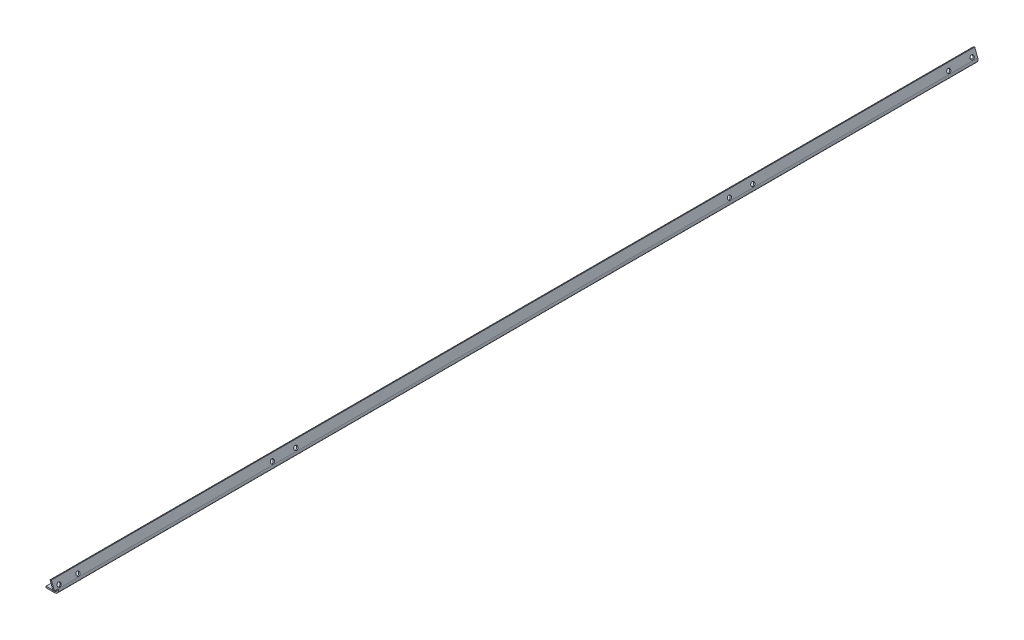
ISO-10303-21;
HEADER;
FILE_DESCRIPTION(('STEP AP214'),'2;1');
FILE_NAME('part.step','',(''),(''),'','','');
FILE_SCHEMA(('AUTOMOTIVE_DESIGN { 1 0 10303 214 1 1 1 1 }'));
ENDSEC;
DATA;
#1=APPLICATION_CONTEXT('core data for automotive mechanical design processes');
#2=APPLICATION_PROTOCOL_DEFINITION('international standard','automotive_design',2000,#1);
#3=PRODUCT_CONTEXT('',#1,'mechanical');
#4=PRODUCT('Part','Part','',(#3));
#5=PRODUCT_RELATED_PRODUCT_CATEGORY('part','',(#4));
#6=PRODUCT_DEFINITION_FORMATION('','',#4);
#7=PRODUCT_DEFINITION_CONTEXT('part definition',#1,'design');
#8=PRODUCT_DEFINITION('design','',#6,#7);
#9=PRODUCT_DEFINITION_SHAPE('','',#8);
#10=(LENGTH_UNIT() NAMED_UNIT(*) SI_UNIT(.MILLI.,.METRE.));
#11=(NAMED_UNIT(*) PLANE_ANGLE_UNIT() SI_UNIT($,.RADIAN.));
#12=(NAMED_UNIT(*) SI_UNIT($,.STERADIAN.) SOLID_ANGLE_UNIT());
#13=UNCERTAINTY_MEASURE_WITH_UNIT(LENGTH_MEASURE(1.E-05),#10,'distance_accuracy_value','');
#14=(GEOMETRIC_REPRESENTATION_CONTEXT(3) GLOBAL_UNCERTAINTY_ASSIGNED_CONTEXT((#13)) GLOBAL_UNIT_ASSIGNED_CONTEXT((#10,
#11,#12)) REPRESENTATION_CONTEXT('',''));
#15=CARTESIAN_POINT('',(0.,0.,0.));
#16=DIRECTION('',(0.,0.,1.));
#17=DIRECTION('',(1.,0.,0.));
#18=AXIS2_PLACEMENT_3D('',#15,#16,#17);
#19=CARTESIAN_POINT('',(-11.5613673458875,8.00000000000001,985.));
#20=DIRECTION('',(0.,0.,-1.));
#21=DIRECTION('',(-1.,0.,0.));
#22=AXIS2_PLACEMENT_3D('',#19,#20,#21);
#23=CYLINDRICAL_SURFACE('',#22,5.);
#24=DIRECTION('',(0.,0.,-1.));
#25=VECTOR('',#24,1.);
#26=CARTESIAN_POINT('',(-11.5613673458875,3.,985.));
#27=LINE('',#26,#25);
#28=CARTESIAN_POINT('',(-11.5613673458875,3.,977.));
#29=VERTEX_POINT('',#28);
#30=CARTESIAN_POINT('',(-11.5613673458875,3.,-985.));
#31=VERTEX_POINT('',#30);
#32=EDGE_CURVE('E153',#29,#31,#27,.T.);
#33=ORIENTED_EDGE('',*,*,#32,.F.);
#34=CARTESIAN_POINT('',(-11.5613673458875,8.00000000000001,977.));
#35=DIRECTION('',(0.,0.,-1.));
#36=DIRECTION('',(0.,1.,0.));
#37=AXIS2_PLACEMENT_3D('',#34,#35,#36);
#38=CIRCLE('',#37,5.);
#39=CARTESIAN_POINT('',(-6.88219611129137,9.76220218968441,977.));
#40=VERTEX_POINT('',#39);
#41=EDGE_CURVE('E124',#40,#29,#38,.T.);
#42=ORIENTED_EDGE('',*,*,#41,.F.);
#43=DIRECTION('',(0.,0.,-1.));
#44=VECTOR('',#43,1.);
#45=CARTESIAN_POINT('',(-6.88219611129137,9.76220218968441,985.));
#46=LINE('',#45,#44);
#47=CARTESIAN_POINT('',(-6.88219611129137,9.76220218968441,-985.));
#48=VERTEX_POINT('',#47);
#49=EDGE_CURVE('E155',#40,#48,#46,.T.);
#50=ORIENTED_EDGE('',*,*,#49,.T.);
#51=CARTESIAN_POINT('',(-11.5613673458875,8.00000000000001,-985.));
#52=DIRECTION('',(0.,0.,1.));
#53=DIRECTION('',(1.,0.,0.));
#54=AXIS2_PLACEMENT_3D('',#51,#52,#53);
#55=CIRCLE('',#54,5.);
#56=EDGE_CURVE('E180',#31,#48,#55,.T.);
#57=ORIENTED_EDGE('',*,*,#56,.F.);
#58=EDGE_LOOP('',(#33,#42,#50,#57));
#59=FACE_BOUND('',#58,.T.);
#60=ADVANCED_FACE('F36',(#59),#23,.F.);
#61=CARTESIAN_POINT('',(0.,3.,985.));
#62=DIRECTION('',(0.,1.,0.));
#63=DIRECTION('',(-1.,0.,0.));
#64=AXIS2_PLACEMENT_3D('',#61,#62,#63);
#65=PLANE('',#64);
#66=DIRECTION('',(0.,0.,-1.));
#67=VECTOR('',#66,1.);
#68=CARTESIAN_POINT('',(-30.,3.,985.));
#69=LINE('',#68,#67);
#70=CARTESIAN_POINT('',(-30.,3.,977.));
#71=VERTEX_POINT('',#70);
#72=CARTESIAN_POINT('',(-30.,3.,-985.));
#73=VERTEX_POINT('',#72);
#74=EDGE_CURVE('E147',#71,#73,#69,.T.);
#75=ORIENTED_EDGE('',*,*,#74,.F.);
#76=DIRECTION('',(-1.,0.,0.));
#77=VECTOR('',#76,1.);
#78=CARTESIAN_POINT('',(0.,3.,977.));
#79=LINE('',#78,#77);
#80=EDGE_CURVE('E128',#29,#71,#79,.T.);
#81=ORIENTED_EDGE('',*,*,#80,.F.);
#82=ORIENTED_EDGE('',*,*,#32,.T.);
#83=DIRECTION('',(1.,0.,0.));
#84=VECTOR('',#83,1.);
#85=CARTESIAN_POINT('',(0.,3.,-985.));
#86=LINE('',#85,#84);
#87=EDGE_CURVE('E188',#73,#31,#86,.T.);
#88=ORIENTED_EDGE('',*,*,#87,.F.);
#89=EDGE_LOOP('',(#75,#81,#82,#88));
#90=FACE_BOUND('',#89,.T.);
#91=ADVANCED_FACE('F219',(#90),#65,.T.);
#92=CARTESIAN_POINT('',(-30.,0.,985.));
#93=DIRECTION('',(-1.,0.,0.));
#94=DIRECTION('',(0.,0.,1.));
#95=AXIS2_PLACEMENT_3D('',#92,#93,#94);
#96=PLANE('',#95);
#97=DIRECTION('',(0.,0.,-1.));
#98=VECTOR('',#97,1.);
#99=CARTESIAN_POINT('',(-30.,0.,985.));
#100=LINE('',#99,#98);
#101=CARTESIAN_POINT('',(-30.,0.,977.));
#102=VERTEX_POINT('',#101);
#103=CARTESIAN_POINT('',(-30.,0.,-985.));
#104=VERTEX_POINT('',#103);
#105=EDGE_CURVE('E145',#102,#104,#100,.T.);
#106=ORIENTED_EDGE('',*,*,#105,.F.);
#107=DIRECTION('',(0.,-1.,0.));
#108=VECTOR('',#107,1.);
#109=CARTESIAN_POINT('',(-30.,0.,977.));
#110=LINE('',#109,#108);
#111=EDGE_CURVE('E127',#102,#71,#110,.F.);
#112=ORIENTED_EDGE('',*,*,#111,.T.);
#113=ORIENTED_EDGE('',*,*,#74,.T.);
#114=DIRECTION('',(0.,1.,0.));
#115=VECTOR('',#114,1.);
#116=CARTESIAN_POINT('',(-30.,0.,-985.));
#117=LINE('',#116,#115);
#118=EDGE_CURVE('E190',#104,#73,#117,.T.);
#119=ORIENTED_EDGE('',*,*,#118,.F.);
#120=EDGE_LOOP('',(#106,#112,#113,#119));
#121=FACE_BOUND('',#120,.T.);
#122=ADVANCED_FACE('F224',(#121),#96,.T.);
#123=CARTESIAN_POINT('',(0.,0.,985.));
#124=DIRECTION('',(0.,1.,0.));
#125=DIRECTION('',(-1.,0.,0.));
#126=AXIS2_PLACEMENT_3D('',#123,#124,#125);
#127=PLANE('',#126);
#128=DIRECTION('',(-1.,0.,0.));
#129=VECTOR('',#128,1.);
#130=CARTESIAN_POINT('',(-3.56136734588747,0.,977.));
#131=LINE('',#130,#129);
#132=CARTESIAN_POINT('',(-11.5613673458875,0.,977.));
#133=VERTEX_POINT('',#132);
#134=EDGE_CURVE('E131',#133,#102,#131,.T.);
#135=ORIENTED_EDGE('',*,*,#134,.T.);
#136=ORIENTED_EDGE('',*,*,#105,.T.);
#137=DIRECTION('',(1.,0.,0.));
#138=VECTOR('',#137,1.);
#139=CARTESIAN_POINT('',(0.,0.,-985.));
#140=LINE('',#139,#138);
#141=CARTESIAN_POINT('',(-11.5613673458875,0.,-985.));
#142=VERTEX_POINT('',#141);
#143=EDGE_CURVE('E143',#104,#142,#140,.T.);
#144=ORIENTED_EDGE('',*,*,#143,.T.);
#145=DIRECTION('',(0.,0.,-1.));
#146=VECTOR('',#145,1.);
#147=CARTESIAN_POINT('',(-11.5613673458875,0.,985.));
#148=LINE('',#147,#146);
#149=EDGE_CURVE('E83',#133,#142,#148,.T.);
#150=ORIENTED_EDGE('',*,*,#149,.F.);
#151=EDGE_LOOP('',(#135,#136,#144,#150));
#152=FACE_BOUND('',#151,.T.);
#153=ADVANCED_FACE('F141',(#152),#127,.F.);
#154=CARTESIAN_POINT('',(-11.5613673458875,8.00000000000001,985.));
#155=DIRECTION('',(0.,0.,-1.));
#156=DIRECTION('',(-1.,0.,0.));
#157=AXIS2_PLACEMENT_3D('',#154,#155,#156);
#158=CYLINDRICAL_SURFACE('',#157,8.);
#159=CARTESIAN_POINT('',(-11.5613673458875,8.00000000000001,977.));
#160=DIRECTION('',(0.,0.,-1.));
#161=DIRECTION('',(-1.,0.,0.));
#162=AXIS2_PLACEMENT_3D('',#159,#160,#161);
#163=CIRCLE('',#162,8.);
#164=CARTESIAN_POINT('',(-4.07469337053373,10.819523503495,977.));
#165=VERTEX_POINT('',#164);
#166=EDGE_CURVE('E122',#165,#133,#163,.T.);
#167=ORIENTED_EDGE('',*,*,#166,.T.);
#168=ORIENTED_EDGE('',*,*,#149,.T.);
#169=CARTESIAN_POINT('',(-11.5613673458875,8.00000000000001,-985.));
#170=DIRECTION('',(0.,0.,-1.));
#171=DIRECTION('',(-1.,0.,0.));
#172=AXIS2_PLACEMENT_3D('',#169,#170,#171);
#173=CIRCLE('',#172,8.);
#174=CARTESIAN_POINT('',(-4.07469337053373,10.819523503495,-985.));
#175=VERTEX_POINT('',#174);
#176=EDGE_CURVE('E196',#142,#175,#173,.F.);
#177=ORIENTED_EDGE('',*,*,#176,.T.);
#178=DIRECTION('',(0.,0.,-1.));
#179=VECTOR('',#178,1.);
#180=CARTESIAN_POINT('',(-4.07469337053373,10.819523503495,985.));
#181=LINE('',#180,#179);
#182=EDGE_CURVE('E89',#165,#175,#181,.T.);
#183=ORIENTED_EDGE('',*,*,#182,.F.);
#184=EDGE_LOOP('',(#167,#168,#177,#183));
#185=FACE_BOUND('',#184,.T.);
#186=ADVANCED_FACE('F138',(#185),#158,.T.);
#187=CARTESIAN_POINT('',(-4.07469337053373,10.819523503495,-985.));
#188=DIRECTION('',(0.,0.,-1.));
#189=DIRECTION('',(-1.,0.,0.));
#190=AXIS2_PLACEMENT_3D('',#187,#188,#189);
#191=PLANE('',#190);
#192=DIRECTION('',(-0.935834246919218,-0.35244043793688,0.));
#193=VECTOR('',#192,1.);
#194=CARTESIAN_POINT('',(-4.07469337053373,10.819523503495,-985.));
#195=LINE('',#194,#193);
#196=EDGE_CURVE('E45',#175,#48,#195,.T.);
#197=ORIENTED_EDGE('',*,*,#196,.F.);
#198=ORIENTED_EDGE('',*,*,#176,.F.);
#199=DIRECTION('',(0.,-1.,0.));
#200=VECTOR('',#199,1.);
#201=CARTESIAN_POINT('',(-11.5613673458875,3.,-985.));
#202=LINE('',#201,#200);
#203=EDGE_CURVE('E162',#31,#142,#202,.T.);
#204=ORIENTED_EDGE('',*,*,#203,.F.);
#205=ORIENTED_EDGE('',*,*,#56,.T.);
#206=EDGE_LOOP('',(#197,#198,#204,#205));
#207=FACE_BOUND('',#206,.T.);
#208=ADVANCED_FACE('F38',(#207),#191,.T.);
#209=CARTESIAN_POINT('',(-11.5613673458875,3.,-985.));
#210=DIRECTION('',(0.,0.,-1.));
#211=DIRECTION('',(-1.,0.,0.));
#212=AXIS2_PLACEMENT_3D('',#209,#210,#211);
#213=PLANE('',#212);
#214=DIRECTION('',(-0.35244043793688,0.935834246919218,0.));
#215=VECTOR('',#214,1.);
#216=CARTESIAN_POINT('',(0.,0.,-985.));
#217=LINE('',#216,#215);
#218=CARTESIAN_POINT('',(-10.5732131381064,28.0750274075766,-985.));
#219=VERTEX_POINT('',#218);
#220=EDGE_CURVE('E171',#175,#219,#217,.T.);
#221=ORIENTED_EDGE('',*,*,#220,.F.);
#222=ORIENTED_EDGE('',*,*,#196,.T.);
#223=DIRECTION('',(-0.35244043793688,0.935834246919218,0.));
#224=VECTOR('',#223,1.);
#225=CARTESIAN_POINT('',(-2.80750274075764,-1.05732131381064,-985.));
#226=LINE('',#225,#224);
#227=CARTESIAN_POINT('',(-13.380715878864,27.0177060937659,-985.));
#228=VERTEX_POINT('',#227);
#229=EDGE_CURVE('E170',#48,#228,#226,.T.);
#230=ORIENTED_EDGE('',*,*,#229,.T.);
#231=DIRECTION('',(0.935834246919219,0.352440437936879,0.));
#232=VECTOR('',#231,1.);
#233=CARTESIAN_POINT('',(-13.380715878864,27.0177060937659,-985.));
#234=LINE('',#233,#232);
#235=EDGE_CURVE('E181',#228,#219,#234,.T.);
#236=ORIENTED_EDGE('',*,*,#235,.T.);
#237=EDGE_LOOP('',(#221,#222,#230,#236));
#238=FACE_BOUND('',#237,.T.);
#239=ADVANCED_FACE('F168',(#238),#213,.T.);
#240=CARTESIAN_POINT('',(0.,0.,985.));
#241=DIRECTION('',(-0.935834246919218,-0.35244043793688,0.));
#242=DIRECTION('',(0.35244043793688,-0.935834246919218,0.));
#243=AXIS2_PLACEMENT_3D('',#240,#241,#242);
#244=PLANE('',#243);
#245=CARTESIAN_POINT('',(-5.99148744492689,15.9091821976265,-925.));
#246=DIRECTION('',(-0.935834246919218,-0.35244043793688,0.));
#247=DIRECTION('',(0.35244043793688,-0.935834246919218,0.));
#248=AXIS2_PLACEMENT_3D('',#245,#246,#247);
#249=CIRCLE('',#248,4.25);
#250=CARTESIAN_POINT('',(-4.49361558369515,11.9318866482198,-925.));
#251=VERTEX_POINT('',#250);
#252=EDGE_CURVE('E460',#251,#251,#249,.T.);
#253=ORIENTED_EDGE('',*,*,#252,.T.);
#254=EDGE_LOOP('',(#253));
#255=FACE_BOUND('',#254,.T.);
#256=CARTESIAN_POINT('',(-5.99148744492684,15.9091821976265,-975.));
#257=DIRECTION('',(-0.935834246919218,-0.35244043793688,0.));
#258=DIRECTION('',(0.35244043793688,-0.935834246919218,0.));
#259=AXIS2_PLACEMENT_3D('',#256,#257,#258);
#260=CIRCLE('',#259,4.25);
#261=CARTESIAN_POINT('',(-4.4936155836951,11.9318866482198,-975.));
#262=VERTEX_POINT('',#261);
#263=EDGE_CURVE('E462',#262,#262,#260,.T.);
#264=ORIENTED_EDGE('',*,*,#263,.T.);
#265=EDGE_LOOP('',(#264));
#266=FACE_BOUND('',#265,.T.);
#267=CARTESIAN_POINT('',(-5.99148744492695,15.9091821976267,468.000000000009));
#268=DIRECTION('',(-0.935834246919218,-0.35244043793688,0.));
#269=DIRECTION('',(0.35244043793688,-0.935834246919218,0.));
#270=AXIS2_PLACEMENT_3D('',#267,#268,#269);
#271=CIRCLE('',#270,4.24999999999995);
#272=CARTESIAN_POINT('',(-4.49361558369523,11.9318866482201,468.000000000009));
#273=VERTEX_POINT('',#272);
#274=EDGE_CURVE('E469',#273,#273,#271,.T.);
#275=ORIENTED_EDGE('',*,*,#274,.T.);
#276=EDGE_LOOP('',(#275));
#277=FACE_BOUND('',#276,.T.);
#278=CARTESIAN_POINT('',(-5.99148744492689,15.9091821976265,-507.000000000009));
#279=DIRECTION('',(-0.935834246919218,-0.35244043793688,0.));
#280=DIRECTION('',(0.35244043793688,-0.935834246919218,0.));
#281=AXIS2_PLACEMENT_3D('',#278,#279,#280);
#282=CIRCLE('',#281,4.25);
#283=CARTESIAN_POINT('',(-4.49361558369515,11.9318866482199,-507.000000000009));
#284=VERTEX_POINT('',#283);
#285=EDGE_CURVE('E473',#284,#284,#282,.T.);
#286=ORIENTED_EDGE('',*,*,#285,.T.);
#287=EDGE_LOOP('',(#286));
#288=FACE_BOUND('',#287,.T.);
#289=CARTESIAN_POINT('',(-5.99148744492689,15.9091821976266,-457.000000000009));
#290=DIRECTION('',(-0.935834246919218,-0.35244043793688,0.));
#291=DIRECTION('',(0.35244043793688,-0.935834246919218,0.));
#292=AXIS2_PLACEMENT_3D('',#289,#290,#291);
#293=CIRCLE('',#292,4.24999999999995);
#294=CARTESIAN_POINT('',(-4.49361558369517,11.9318866482199,-457.000000000009));
#295=VERTEX_POINT('',#294);
#296=EDGE_CURVE('E477',#295,#295,#293,.T.);
#297=ORIENTED_EDGE('',*,*,#296,.T.);
#298=EDGE_LOOP('',(#297));
#299=FACE_BOUND('',#298,.T.);
#300=CARTESIAN_POINT('',(-5.99148744492684,15.9091821976267,518.000000000009));
#301=DIRECTION('',(-0.935834246919218,-0.35244043793688,0.));
#302=DIRECTION('',(0.35244043793688,-0.935834246919218,0.));
#303=AXIS2_PLACEMENT_3D('',#300,#301,#302);
#304=CIRCLE('',#303,4.25);
#305=CARTESIAN_POINT('',(-4.4936155836951,11.93188664822,518.000000000009));
#306=VERTEX_POINT('',#305);
#307=EDGE_CURVE('E481',#306,#306,#304,.T.);
#308=ORIENTED_EDGE('',*,*,#307,.T.);
#309=EDGE_LOOP('',(#308));
#310=FACE_BOUND('',#309,.T.);
#311=CARTESIAN_POINT('',(-5.99148744492689,15.9091821976267,933.000000000009));
#312=DIRECTION('',(-0.935834246919218,-0.35244043793688,0.));
#313=DIRECTION('',(0.35244043793688,-0.935834246919218,0.));
#314=AXIS2_PLACEMENT_3D('',#311,#312,#313);
#315=CIRCLE('',#314,4.25);
#316=CARTESIAN_POINT('',(-4.49361558369515,11.93188664822,933.000000000009));
#317=VERTEX_POINT('',#316);
#318=EDGE_CURVE('E270',#317,#317,#315,.T.);
#319=ORIENTED_EDGE('',*,*,#318,.T.);
#320=EDGE_LOOP('',(#319));
#321=FACE_BOUND('',#320,.T.);
#322=CARTESIAN_POINT('',(-5.99148744492695,15.9091821976267,973.000000000009));
#323=DIRECTION('',(-0.935834246919218,-0.35244043793688,0.));
#324=DIRECTION('',(0.35244043793688,-0.935834246919218,0.));
#325=AXIS2_PLACEMENT_3D('',#322,#323,#324);
#326=CIRCLE('',#325,4.25);
#327=CARTESIAN_POINT('',(-4.49361558369521,11.9318866482201,973.000000000009));
#328=VERTEX_POINT('',#327);
#329=EDGE_CURVE('E269',#328,#328,#326,.T.);
#330=ORIENTED_EDGE('',*,*,#329,.T.);
#331=EDGE_LOOP('',(#330));
#332=FACE_BOUND('',#331,.T.);
#333=ORIENTED_EDGE('',*,*,#220,.T.);
#334=DIRECTION('',(0.,0.,-1.));
#335=VECTOR('',#334,1.);
#336=CARTESIAN_POINT('',(-10.5732131381064,28.0750274075766,985.));
#337=LINE('',#336,#335);
#338=CARTESIAN_POINT('',(-10.5732131381064,28.0750274075766,985.));
#339=VERTEX_POINT('',#338);
#340=EDGE_CURVE('E160',#339,#219,#337,.T.);
#341=ORIENTED_EDGE('',*,*,#340,.F.);
#342=DIRECTION('',(-0.35244043793688,0.935834246919218,0.));
#343=VECTOR('',#342,1.);
#344=CARTESIAN_POINT('',(0.,0.,985.));
#345=LINE('',#344,#343);
#346=CARTESIAN_POINT('',(-4.07469337053373,10.819523503495,985.));
#347=VERTEX_POINT('',#346);
#348=EDGE_CURVE('E95',#347,#339,#345,.T.);
#349=ORIENTED_EDGE('',*,*,#348,.F.);
#350=EDGE_CURVE('E53',#347,#165,#181,.T.);
#351=ORIENTED_EDGE('',*,*,#350,.T.);
#352=ORIENTED_EDGE('',*,*,#182,.T.);
#353=EDGE_LOOP('',(#333,#341,#349,#351,#352));
#354=FACE_BOUND('',#353,.T.);
#355=ADVANCED_FACE('F207',(#255,#266,#277,#288,#299,#310,#321,#332,#354),#244,.F.);
#356=CARTESIAN_POINT('',(-13.380715878864,27.0177060937659,985.));
#357=DIRECTION('',(-0.352440437936879,0.935834246919219,0.));
#358=DIRECTION('',(-0.935834246919219,-0.352440437936879,0.));
#359=AXIS2_PLACEMENT_3D('',#356,#357,#358);
#360=PLANE('',#359);
#361=ORIENTED_EDGE('',*,*,#235,.F.);
#362=DIRECTION('',(0.,0.,-1.));
#363=VECTOR('',#362,1.);
#364=CARTESIAN_POINT('',(-13.380715878864,27.0177060937659,985.));
#365=LINE('',#364,#363);
#366=CARTESIAN_POINT('',(-13.380715878864,27.0177060937659,985.));
#367=VERTEX_POINT('',#366);
#368=EDGE_CURVE('E158',#367,#228,#365,.T.);
#369=ORIENTED_EDGE('',*,*,#368,.F.);
#370=DIRECTION('',(0.935834246919219,0.352440437936879,0.));
#371=VECTOR('',#370,1.);
#372=CARTESIAN_POINT('',(-13.380715878864,27.0177060937659,985.));
#373=LINE('',#372,#371);
#374=EDGE_CURVE('E197',#367,#339,#373,.T.);
#375=ORIENTED_EDGE('',*,*,#374,.T.);
#376=ORIENTED_EDGE('',*,*,#340,.T.);
#377=EDGE_LOOP('',(#361,#369,#375,#376));
#378=FACE_BOUND('',#377,.T.);
#379=ADVANCED_FACE('F206',(#378),#360,.T.);
#380=CARTESIAN_POINT('',(-2.80750274075764,-1.05732131381064,985.));
#381=DIRECTION('',(-0.935834246919218,-0.35244043793688,0.));
#382=DIRECTION('',(0.35244043793688,-0.935834246919218,0.));
#383=AXIS2_PLACEMENT_3D('',#380,#381,#382);
#384=PLANE('',#383);
#385=CARTESIAN_POINT('',(-8.79899018568453,14.8518608838159,-925.));
#386=DIRECTION('',(-0.935834246919218,-0.35244043793688,0.));
#387=DIRECTION('',(0.35244043793688,-0.935834246919218,0.));
#388=AXIS2_PLACEMENT_3D('',#385,#386,#387);
#389=CIRCLE('',#388,4.25);
#390=CARTESIAN_POINT('',(-7.30111832445279,10.8745653344092,-925.));
#391=VERTEX_POINT('',#390);
#392=EDGE_CURVE('E240',#391,#391,#389,.T.);
#393=ORIENTED_EDGE('',*,*,#392,.F.);
#394=EDGE_LOOP('',(#393));
#395=FACE_BOUND('',#394,.T.);
#396=CARTESIAN_POINT('',(-8.79899018568447,14.8518608838159,-975.));
#397=DIRECTION('',(-0.935834246919218,-0.35244043793688,0.));
#398=DIRECTION('',(0.35244043793688,-0.935834246919218,0.));
#399=AXIS2_PLACEMENT_3D('',#396,#397,#398);
#400=CIRCLE('',#399,4.25);
#401=CARTESIAN_POINT('',(-7.30111832445274,10.8745653344092,-975.));
#402=VERTEX_POINT('',#401);
#403=EDGE_CURVE('E244',#402,#402,#400,.T.);
#404=ORIENTED_EDGE('',*,*,#403,.F.);
#405=EDGE_LOOP('',(#404));
#406=FACE_BOUND('',#405,.T.);
#407=CARTESIAN_POINT('',(-8.79899018568459,14.851860883816,468.000000000009));
#408=DIRECTION('',(-0.935834246919218,-0.35244043793688,0.));
#409=DIRECTION('',(0.35244043793688,-0.935834246919218,0.));
#410=AXIS2_PLACEMENT_3D('',#407,#408,#409);
#411=CIRCLE('',#410,4.24999999999995);
#412=CARTESIAN_POINT('',(-7.30111832445286,10.8745653344094,468.000000000009));
#413=VERTEX_POINT('',#412);
#414=EDGE_CURVE('E248',#413,#413,#411,.T.);
#415=ORIENTED_EDGE('',*,*,#414,.F.);
#416=EDGE_LOOP('',(#415));
#417=FACE_BOUND('',#416,.T.);
#418=CARTESIAN_POINT('',(-8.79899018568453,14.8518608838159,-507.000000000009));
#419=DIRECTION('',(-0.935834246919218,-0.35244043793688,0.));
#420=DIRECTION('',(0.35244043793688,-0.935834246919218,0.));
#421=AXIS2_PLACEMENT_3D('',#418,#419,#420);
#422=CIRCLE('',#421,4.25);
#423=CARTESIAN_POINT('',(-7.30111832445279,10.8745653344093,-507.000000000009));
#424=VERTEX_POINT('',#423);
#425=EDGE_CURVE('E252',#424,#424,#422,.T.);
#426=ORIENTED_EDGE('',*,*,#425,.F.);
#427=EDGE_LOOP('',(#426));
#428=FACE_BOUND('',#427,.T.);
#429=CARTESIAN_POINT('',(-8.79899018568453,14.8518608838159,-457.000000000009));
#430=DIRECTION('',(-0.935834246919218,-0.35244043793688,0.));
#431=DIRECTION('',(0.35244043793688,-0.935834246919218,0.));
#432=AXIS2_PLACEMENT_3D('',#429,#430,#431);
#433=CIRCLE('',#432,4.24999999999995);
#434=CARTESIAN_POINT('',(-7.30111832445281,10.8745653344093,-457.000000000009));
#435=VERTEX_POINT('',#434);
#436=EDGE_CURVE('E256',#435,#435,#433,.T.);
#437=ORIENTED_EDGE('',*,*,#436,.F.);
#438=EDGE_LOOP('',(#437));
#439=FACE_BOUND('',#438,.T.);
#440=CARTESIAN_POINT('',(-8.79899018568447,14.851860883816,518.000000000009));
#441=DIRECTION('',(-0.935834246919218,-0.35244043793688,0.));
#442=DIRECTION('',(0.35244043793688,-0.935834246919218,0.));
#443=AXIS2_PLACEMENT_3D('',#440,#441,#442);
#444=CIRCLE('',#443,4.25);
#445=CARTESIAN_POINT('',(-7.30111832445274,10.8745653344094,518.000000000009));
#446=VERTEX_POINT('',#445);
#447=EDGE_CURVE('E260',#446,#446,#444,.T.);
#448=ORIENTED_EDGE('',*,*,#447,.F.);
#449=EDGE_LOOP('',(#448));
#450=FACE_BOUND('',#449,.T.);
#451=CARTESIAN_POINT('',(-8.79899018568453,14.8518608838161,933.000000000009));
#452=DIRECTION('',(-0.935834246919218,-0.35244043793688,0.));
#453=DIRECTION('',(0.35244043793688,-0.935834246919218,0.));
#454=AXIS2_PLACEMENT_3D('',#451,#452,#453);
#455=CIRCLE('',#454,4.25);
#456=CARTESIAN_POINT('',(-7.30111832445279,10.8745653344094,933.000000000009));
#457=VERTEX_POINT('',#456);
#458=EDGE_CURVE('E264',#457,#457,#455,.T.);
#459=ORIENTED_EDGE('',*,*,#458,.F.);
#460=EDGE_LOOP('',(#459));
#461=FACE_BOUND('',#460,.T.);
#462=CARTESIAN_POINT('',(-8.79899018568464,14.8518608838161,973.000000000009));
#463=DIRECTION('',(-0.935834246919218,-0.35244043793688,0.));
#464=DIRECTION('',(0.35244043793688,-0.935834246919218,0.));
#465=AXIS2_PLACEMENT_3D('',#462,#463,#464);
#466=CIRCLE('',#465,4.25);
#467=CARTESIAN_POINT('',(-7.3011183244529,10.8745653344094,973.000000000009));
#468=VERTEX_POINT('',#467);
#469=EDGE_CURVE('E267',#468,#468,#466,.T.);
#470=ORIENTED_EDGE('',*,*,#469,.F.);
#471=EDGE_LOOP('',(#470));
#472=FACE_BOUND('',#471,.T.);
#473=ORIENTED_EDGE('',*,*,#229,.F.);
#474=ORIENTED_EDGE('',*,*,#49,.F.);
#475=CARTESIAN_POINT('',(-6.88219611129137,9.76220218968441,985.));
#476=VERTEX_POINT('',#475);
#477=EDGE_CURVE('E156',#476,#40,#46,.T.);
#478=ORIENTED_EDGE('',*,*,#477,.F.);
#479=DIRECTION('',(-0.35244043793688,0.935834246919218,0.));
#480=VECTOR('',#479,1.);
#481=CARTESIAN_POINT('',(-2.80750274075764,-1.05732131381064,985.));
#482=LINE('',#481,#480);
#483=EDGE_CURVE('E200',#476,#367,#482,.T.);
#484=ORIENTED_EDGE('',*,*,#483,.T.);
#485=ORIENTED_EDGE('',*,*,#368,.T.);
#486=EDGE_LOOP('',(#473,#474,#478,#484,#485));
#487=FACE_BOUND('',#486,.T.);
#488=ADVANCED_FACE('F176',(#395,#406,#417,#428,#439,#450,#461,#472,#487),#384,.T.);
#489=CARTESIAN_POINT('',(-11.5613673458875,8.00000000000001,985.));
#490=DIRECTION('',(0.,0.,1.));
#491=DIRECTION('',(1.,0.,0.));
#492=AXIS2_PLACEMENT_3D('',#489,#490,#491);
#493=PLANE('',#492);
#494=ORIENTED_EDGE('',*,*,#348,.T.);
#495=ORIENTED_EDGE('',*,*,#374,.F.);
#496=ORIENTED_EDGE('',*,*,#483,.F.);
#497=DIRECTION('',(0.935834246919218,0.35244043793688,0.));
#498=VECTOR('',#497,1.);
#499=CARTESIAN_POINT('',(-6.88219611129137,9.76220218968441,985.));
#500=LINE('',#499,#498);
#501=EDGE_CURVE('E11',#476,#347,#500,.T.);
#502=ORIENTED_EDGE('',*,*,#501,.T.);
#503=EDGE_LOOP('',(#494,#495,#496,#502));
#504=FACE_BOUND('',#503,.T.);
#505=ADVANCED_FACE('F230',(#504),#493,.T.);
#506=CARTESIAN_POINT('',(-11.5613673458875,8.00000000000001,-985.));
#507=DIRECTION('',(0.,0.,1.));
#508=DIRECTION('',(1.,0.,0.));
#509=AXIS2_PLACEMENT_3D('',#506,#507,#508);
#510=PLANE('',#509);
#511=ORIENTED_EDGE('',*,*,#87,.T.);
#512=ORIENTED_EDGE('',*,*,#203,.T.);
#513=ORIENTED_EDGE('',*,*,#143,.F.);
#514=ORIENTED_EDGE('',*,*,#118,.T.);
#515=EDGE_LOOP('',(#511,#512,#513,#514));
#516=FACE_BOUND('',#515,.T.);
#517=ADVANCED_FACE('F235',(#516),#510,.F.);
#518=CARTESIAN_POINT('',(-3.56136734588747,0.,977.));
#519=DIRECTION('',(0.,0.,-1.));
#520=DIRECTION('',(-1.,0.,0.));
#521=AXIS2_PLACEMENT_3D('',#518,#519,#520);
#522=PLANE('',#521);
#523=ORIENTED_EDGE('',*,*,#111,.F.);
#524=ORIENTED_EDGE('',*,*,#134,.F.);
#525=DIRECTION('',(0.,-1.,0.));
#526=VECTOR('',#525,1.);
#527=CARTESIAN_POINT('',(-11.5613673458875,0.,977.));
#528=LINE('',#527,#526);
#529=EDGE_CURVE('E118',#133,#29,#528,.F.);
#530=ORIENTED_EDGE('',*,*,#529,.T.);
#531=ORIENTED_EDGE('',*,*,#80,.T.);
#532=EDGE_LOOP('',(#523,#524,#530,#531));
#533=FACE_BOUND('',#532,.T.);
#534=ADVANCED_FACE('F132',(#533),#522,.F.);
#535=CARTESIAN_POINT('',(-6.88219611129132,9.76220218968441,981.));
#536=DIRECTION('',(0.35244043793688,-0.935834246919218,0.));
#537=DIRECTION('',(0.,0.,-1.));
#538=AXIS2_PLACEMENT_3D('',#535,#536,#537);
#539=PLANE('',#538);
#540=ORIENTED_EDGE('',*,*,#501,.F.);
#541=ORIENTED_EDGE('',*,*,#477,.T.);
#542=DIRECTION('',(-0.935834246919218,-0.35244043793688,0.));
#543=VECTOR('',#542,1.);
#544=CARTESIAN_POINT('',(-6.88219611129137,9.76220218968441,977.));
#545=LINE('',#544,#543);
#546=EDGE_CURVE('E136',#40,#165,#545,.F.);
#547=ORIENTED_EDGE('',*,*,#546,.T.);
#548=ORIENTED_EDGE('',*,*,#350,.F.);
#549=EDGE_LOOP('',(#540,#541,#547,#548));
#550=FACE_BOUND('',#549,.T.);
#551=ADVANCED_FACE('F290',(#550),#539,.T.);
#552=CARTESIAN_POINT('',(-11.5613673458875,8.00000000000001,977.));
#553=DIRECTION('',(0.,0.,1.));
#554=DIRECTION('',(0.,-1.,0.));
#555=AXIS2_PLACEMENT_3D('',#552,#553,#554);
#556=PLANE('',#555);
#557=ORIENTED_EDGE('',*,*,#529,.F.);
#558=ORIENTED_EDGE('',*,*,#166,.F.);
#559=ORIENTED_EDGE('',*,*,#546,.F.);
#560=ORIENTED_EDGE('',*,*,#41,.T.);
#561=EDGE_LOOP('',(#557,#558,#559,#560));
#562=FACE_BOUND('',#561,.T.);
#563=ADVANCED_FACE('F120',(#562),#556,.T.);
#564=CARTESIAN_POINT('',(0.149387094898257,18.2218700686427,973.000000000009));
#565=DIRECTION('',(-0.935834246919218,-0.35244043793688,0.));
#566=DIRECTION('',(0.35244043793688,-0.935834246919218,0.));
#567=AXIS2_PLACEMENT_3D('',#564,#565,#566);
#568=CYLINDRICAL_SURFACE('',#567,4.25);
#569=ORIENTED_EDGE('',*,*,#469,.T.);
#570=EDGE_LOOP('',(#569));
#571=FACE_BOUND('',#570,.T.);
#572=ORIENTED_EDGE('',*,*,#329,.F.);
#573=EDGE_LOOP('',(#572));
#574=FACE_BOUND('',#573,.T.);
#575=ADVANCED_FACE('F375',(#571,#574),#568,.F.);
#576=CARTESIAN_POINT('',(0.149387094898312,18.2218700686427,933.000000000009));
#577=DIRECTION('',(-0.935834246919218,-0.35244043793688,0.));
#578=DIRECTION('',(0.35244043793688,-0.935834246919218,0.));
#579=AXIS2_PLACEMENT_3D('',#576,#577,#578);
#580=CYLINDRICAL_SURFACE('',#579,4.25);
#581=ORIENTED_EDGE('',*,*,#458,.T.);
#582=EDGE_LOOP('',(#581));
#583=FACE_BOUND('',#582,.T.);
#584=ORIENTED_EDGE('',*,*,#318,.F.);
#585=EDGE_LOOP('',(#584));
#586=FACE_BOUND('',#585,.T.);
#587=ADVANCED_FACE('F385',(#583,#586),#580,.F.);
#588=CARTESIAN_POINT('',(0.149387094898368,18.2218700686426,518.000000000009));
#589=DIRECTION('',(-0.935834246919218,-0.35244043793688,0.));
#590=DIRECTION('',(0.35244043793688,-0.935834246919218,0.));
#591=AXIS2_PLACEMENT_3D('',#588,#589,#590);
#592=CYLINDRICAL_SURFACE('',#591,4.25);
#593=ORIENTED_EDGE('',*,*,#447,.T.);
#594=EDGE_LOOP('',(#593));
#595=FACE_BOUND('',#594,.T.);
#596=ORIENTED_EDGE('',*,*,#307,.F.);
#597=EDGE_LOOP('',(#596));
#598=FACE_BOUND('',#597,.T.);
#599=ADVANCED_FACE('F394',(#595,#598),#592,.F.);
#600=CARTESIAN_POINT('',(0.149387094898312,18.2218700686425,-457.000000000009));
#601=DIRECTION('',(-0.935834246919218,-0.35244043793688,0.));
#602=DIRECTION('',(0.35244043793688,-0.935834246919218,0.));
#603=AXIS2_PLACEMENT_3D('',#600,#601,#602);
#604=CYLINDRICAL_SURFACE('',#603,4.24999999999995);
#605=ORIENTED_EDGE('',*,*,#436,.T.);
#606=EDGE_LOOP('',(#605));
#607=FACE_BOUND('',#606,.T.);
#608=ORIENTED_EDGE('',*,*,#296,.F.);
#609=EDGE_LOOP('',(#608));
#610=FACE_BOUND('',#609,.T.);
#611=ADVANCED_FACE('F404',(#607,#610),#604,.F.);
#612=CARTESIAN_POINT('',(0.149387094898312,18.2218700686425,-507.000000000009));
#613=DIRECTION('',(-0.935834246919218,-0.35244043793688,0.));
#614=DIRECTION('',(0.35244043793688,-0.935834246919218,0.));
#615=AXIS2_PLACEMENT_3D('',#612,#613,#614);
#616=CYLINDRICAL_SURFACE('',#615,4.25);
#617=ORIENTED_EDGE('',*,*,#425,.T.);
#618=EDGE_LOOP('',(#617));
#619=FACE_BOUND('',#618,.T.);
#620=ORIENTED_EDGE('',*,*,#285,.F.);
#621=EDGE_LOOP('',(#620));
#622=FACE_BOUND('',#621,.T.);
#623=ADVANCED_FACE('F414',(#619,#622),#616,.F.);
#624=CARTESIAN_POINT('',(0.149387094898257,18.2218700686426,468.000000000009));
#625=DIRECTION('',(-0.935834246919218,-0.35244043793688,0.));
#626=DIRECTION('',(0.35244043793688,-0.935834246919218,0.));
#627=AXIS2_PLACEMENT_3D('',#624,#625,#626);
#628=CYLINDRICAL_SURFACE('',#627,4.24999999999995);
#629=ORIENTED_EDGE('',*,*,#414,.T.);
#630=EDGE_LOOP('',(#629));
#631=FACE_BOUND('',#630,.T.);
#632=ORIENTED_EDGE('',*,*,#274,.F.);
#633=EDGE_LOOP('',(#632));
#634=FACE_BOUND('',#633,.T.);
#635=ADVANCED_FACE('F424',(#631,#634),#628,.F.);
#636=CARTESIAN_POINT('',(0.149387094898368,18.2218700686425,-975.));
#637=DIRECTION('',(-0.935834246919218,-0.35244043793688,0.));
#638=DIRECTION('',(0.35244043793688,-0.935834246919218,0.));
#639=AXIS2_PLACEMENT_3D('',#636,#637,#638);
#640=CYLINDRICAL_SURFACE('',#639,4.25);
#641=ORIENTED_EDGE('',*,*,#403,.T.);
#642=EDGE_LOOP('',(#641));
#643=FACE_BOUND('',#642,.T.);
#644=ORIENTED_EDGE('',*,*,#263,.F.);
#645=EDGE_LOOP('',(#644));
#646=FACE_BOUND('',#645,.T.);
#647=ADVANCED_FACE('F434',(#643,#646),#640,.F.);
#648=CARTESIAN_POINT('',(0.149387094898312,18.2218700686425,-925.));
#649=DIRECTION('',(-0.935834246919218,-0.35244043793688,0.));
#650=DIRECTION('',(0.35244043793688,-0.935834246919218,0.));
#651=AXIS2_PLACEMENT_3D('',#648,#649,#650);
#652=CYLINDRICAL_SURFACE('',#651,4.25);
#653=ORIENTED_EDGE('',*,*,#392,.T.);
#654=EDGE_LOOP('',(#653));
#655=FACE_BOUND('',#654,.T.);
#656=ORIENTED_EDGE('',*,*,#252,.F.);
#657=EDGE_LOOP('',(#656));
#658=FACE_BOUND('',#657,.T.);
#659=ADVANCED_FACE('F444',(#655,#658),#652,.F.);
#660=CLOSED_SHELL('',(#60,#91,#122,#153,#186,#208,#239,#355,#379,#488,#505,#517,#534,#551,#563,
#575,#587,#599,#611,#623,#635,#647,#659));
#661=MANIFOLD_SOLID_BREP('B2',#660);
#662=ADVANCED_BREP_SHAPE_REPRESENTATION('',(#18,#661),#14);
#663=SHAPE_DEFINITION_REPRESENTATION(#9,#662);
ENDSEC;
END-ISO-10303-21;
